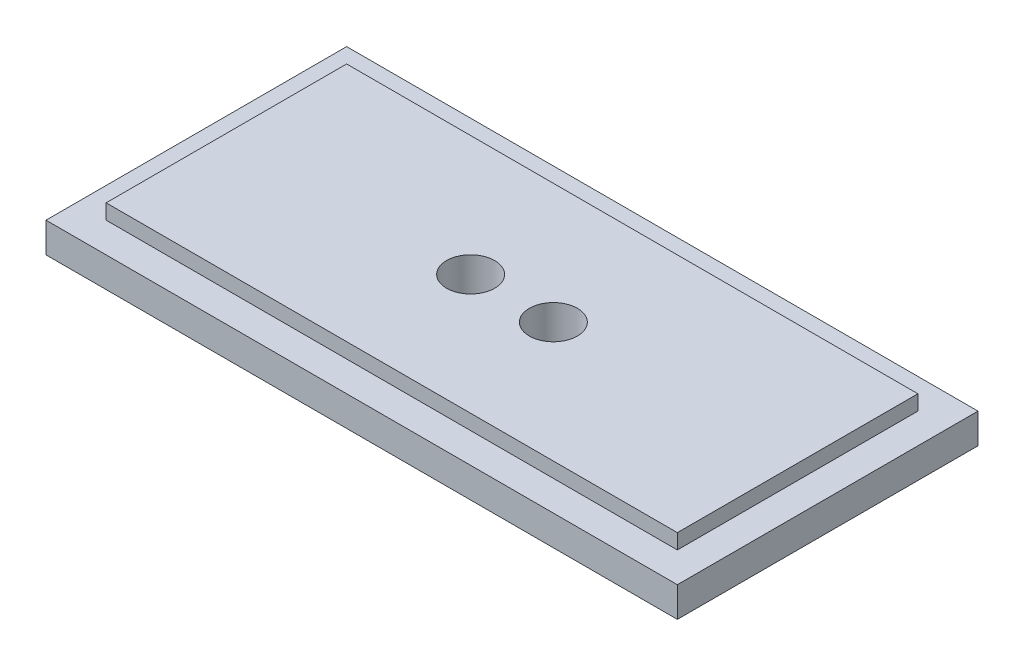
ISO-10303-21;
HEADER;
FILE_DESCRIPTION(('STEP AP214'),'2;1');
FILE_NAME('part.step','',(''),(''),'','','');
FILE_SCHEMA(('AUTOMOTIVE_DESIGN { 1 0 10303 214 1 1 1 1 }'));
ENDSEC;
DATA;
#1=APPLICATION_CONTEXT('core data for automotive mechanical design processes');
#2=APPLICATION_PROTOCOL_DEFINITION('international standard','automotive_design',2000,#1);
#3=PRODUCT_CONTEXT('',#1,'mechanical');
#4=PRODUCT('Part','Part','',(#3));
#5=PRODUCT_RELATED_PRODUCT_CATEGORY('part','',(#4));
#6=PRODUCT_DEFINITION_FORMATION('','',#4);
#7=PRODUCT_DEFINITION_CONTEXT('part definition',#1,'design');
#8=PRODUCT_DEFINITION('design','',#6,#7);
#9=PRODUCT_DEFINITION_SHAPE('','',#8);
#10=(LENGTH_UNIT() NAMED_UNIT(*) SI_UNIT(.MILLI.,.METRE.));
#11=(NAMED_UNIT(*) PLANE_ANGLE_UNIT() SI_UNIT($,.RADIAN.));
#12=(NAMED_UNIT(*) SI_UNIT($,.STERADIAN.) SOLID_ANGLE_UNIT());
#13=UNCERTAINTY_MEASURE_WITH_UNIT(LENGTH_MEASURE(1.E-05),#10,'distance_accuracy_value','');
#14=(GEOMETRIC_REPRESENTATION_CONTEXT(3) GLOBAL_UNCERTAINTY_ASSIGNED_CONTEXT((#13)) GLOBAL_UNIT_ASSIGNED_CONTEXT((#10,
#11,#12)) REPRESENTATION_CONTEXT('',''));
#15=CARTESIAN_POINT('',(0.,0.,0.));
#16=DIRECTION('',(0.,0.,1.));
#17=DIRECTION('',(1.,0.,0.));
#18=AXIS2_PLACEMENT_3D('',#15,#16,#17);
#19=CARTESIAN_POINT('',(0.,0.,0.));
#20=DIRECTION('',(0.,1.,0.));
#21=DIRECTION('',(0.,0.,1.));
#22=AXIS2_PLACEMENT_3D('',#19,#20,#21);
#23=PLANE('',#22);
#24=DIRECTION('',(0.,0.,1.));
#25=VECTOR('',#24,1.);
#26=CARTESIAN_POINT('',(-105.,0.,50.));
#27=LINE('',#26,#25);
#28=CARTESIAN_POINT('',(-105.,0.,-50.));
#29=VERTEX_POINT('',#28);
#30=CARTESIAN_POINT('',(-105.,0.,50.));
#31=VERTEX_POINT('',#30);
#32=EDGE_CURVE('E260',#29,#31,#27,.T.);
#33=ORIENTED_EDGE('',*,*,#32,.F.);
#34=DIRECTION('',(-1.,0.,0.));
#35=VECTOR('',#34,1.);
#36=CARTESIAN_POINT('',(105.,0.,-50.));
#37=LINE('',#36,#35);
#38=CARTESIAN_POINT('',(105.,0.,-50.));
#39=VERTEX_POINT('',#38);
#40=EDGE_CURVE('E265',#39,#29,#37,.T.);
#41=ORIENTED_EDGE('',*,*,#40,.F.);
#42=DIRECTION('',(0.,0.,-1.));
#43=VECTOR('',#42,1.);
#44=CARTESIAN_POINT('',(105.,0.,50.));
#45=LINE('',#44,#43);
#46=CARTESIAN_POINT('',(105.,0.,50.));
#47=VERTEX_POINT('',#46);
#48=EDGE_CURVE('E276',#47,#39,#45,.T.);
#49=ORIENTED_EDGE('',*,*,#48,.F.);
#50=DIRECTION('',(1.,0.,0.));
#51=VECTOR('',#50,1.);
#52=CARTESIAN_POINT('',(105.,0.,50.));
#53=LINE('',#52,#51);
#54=EDGE_CURVE('E274',#31,#47,#53,.T.);
#55=ORIENTED_EDGE('',*,*,#54,.F.);
#56=EDGE_LOOP('',(#33,#41,#49,#55));
#57=FACE_BOUND('',#56,.T.);
#58=DIRECTION('',(1.,0.,0.));
#59=VECTOR('',#58,1.);
#60=CARTESIAN_POINT('',(28.5,0.,-16.));
#61=LINE('',#60,#59);
#62=CARTESIAN_POINT('',(-28.5,0.,-16.));
#63=VERTEX_POINT('',#62);
#64=CARTESIAN_POINT('',(28.5,0.,-16.));
#65=VERTEX_POINT('',#64);
#66=EDGE_CURVE('E175',#63,#65,#61,.T.);
#67=ORIENTED_EDGE('',*,*,#66,.F.);
#68=DIRECTION('',(0.,0.,-1.));
#69=VECTOR('',#68,1.);
#70=CARTESIAN_POINT('',(-28.5,0.,-16.));
#71=LINE('',#70,#69);
#72=CARTESIAN_POINT('',(-28.5,0.,16.));
#73=VERTEX_POINT('',#72);
#74=EDGE_CURVE('E204',#73,#63,#71,.T.);
#75=ORIENTED_EDGE('',*,*,#74,.F.);
#76=DIRECTION('',(-1.,0.,0.));
#77=VECTOR('',#76,1.);
#78=CARTESIAN_POINT('',(28.5,0.,16.));
#79=LINE('',#78,#77);
#80=CARTESIAN_POINT('',(28.5,0.,16.));
#81=VERTEX_POINT('',#80);
#82=EDGE_CURVE('E65',#81,#73,#79,.T.);
#83=ORIENTED_EDGE('',*,*,#82,.F.);
#84=DIRECTION('',(0.,0.,1.));
#85=VECTOR('',#84,1.);
#86=CARTESIAN_POINT('',(28.5,0.,-16.));
#87=LINE('',#86,#85);
#88=EDGE_CURVE('E60',#65,#81,#87,.T.);
#89=ORIENTED_EDGE('',*,*,#88,.F.);
#90=EDGE_LOOP('',(#67,#75,#83,#89));
#91=FACE_BOUND('',#90,.T.);
#92=ADVANCED_FACE('F43',(#57,#91),#23,.F.);
#93=CARTESIAN_POINT('',(-105.,10.,50.));
#94=DIRECTION('',(1.,0.,0.));
#95=DIRECTION('',(0.,0.,-1.));
#96=AXIS2_PLACEMENT_3D('',#93,#94,#95);
#97=PLANE('',#96);
#98=ORIENTED_EDGE('',*,*,#32,.T.);
#99=DIRECTION('',(0.,-1.,0.));
#100=VECTOR('',#99,1.);
#101=CARTESIAN_POINT('',(-105.,10.,50.));
#102=LINE('',#101,#100);
#103=CARTESIAN_POINT('',(-105.,10.,50.));
#104=VERTEX_POINT('',#103);
#105=EDGE_CURVE('E11',#104,#31,#102,.T.);
#106=ORIENTED_EDGE('',*,*,#105,.F.);
#107=DIRECTION('',(0.,0.,1.));
#108=VECTOR('',#107,1.);
#109=CARTESIAN_POINT('',(-105.,10.,50.));
#110=LINE('',#109,#108);
#111=CARTESIAN_POINT('',(-105.,10.,-50.));
#112=VERTEX_POINT('',#111);
#113=EDGE_CURVE('E261',#112,#104,#110,.T.);
#114=ORIENTED_EDGE('',*,*,#113,.F.);
#115=DIRECTION('',(0.,-1.,0.));
#116=VECTOR('',#115,1.);
#117=CARTESIAN_POINT('',(-105.,10.,-50.));
#118=LINE('',#117,#116);
#119=EDGE_CURVE('E271',#112,#29,#118,.T.);
#120=ORIENTED_EDGE('',*,*,#119,.T.);
#121=EDGE_LOOP('',(#98,#106,#114,#120));
#122=FACE_BOUND('',#121,.T.);
#123=ADVANCED_FACE('F45',(#122),#97,.F.);
#124=CARTESIAN_POINT('',(105.,10.,50.));
#125=DIRECTION('',(0.,0.,-1.));
#126=DIRECTION('',(-1.,0.,0.));
#127=AXIS2_PLACEMENT_3D('',#124,#125,#126);
#128=PLANE('',#127);
#129=ORIENTED_EDGE('',*,*,#54,.T.);
#130=DIRECTION('',(0.,-1.,0.));
#131=VECTOR('',#130,1.);
#132=CARTESIAN_POINT('',(105.,10.,50.));
#133=LINE('',#132,#131);
#134=CARTESIAN_POINT('',(105.,10.,50.));
#135=VERTEX_POINT('',#134);
#136=EDGE_CURVE('E52',#135,#47,#133,.T.);
#137=ORIENTED_EDGE('',*,*,#136,.F.);
#138=DIRECTION('',(1.,0.,0.));
#139=VECTOR('',#138,1.);
#140=CARTESIAN_POINT('',(105.,10.,50.));
#141=LINE('',#140,#139);
#142=EDGE_CURVE('E264',#104,#135,#141,.T.);
#143=ORIENTED_EDGE('',*,*,#142,.F.);
#144=ORIENTED_EDGE('',*,*,#105,.T.);
#145=EDGE_LOOP('',(#129,#137,#143,#144));
#146=FACE_BOUND('',#145,.T.);
#147=ADVANCED_FACE('F325',(#146),#128,.F.);
#148=CARTESIAN_POINT('',(105.,10.,50.));
#149=DIRECTION('',(-1.,0.,0.));
#150=DIRECTION('',(0.,0.,1.));
#151=AXIS2_PLACEMENT_3D('',#148,#149,#150);
#152=PLANE('',#151);
#153=ORIENTED_EDGE('',*,*,#48,.T.);
#154=DIRECTION('',(0.,-1.,0.));
#155=VECTOR('',#154,1.);
#156=CARTESIAN_POINT('',(105.,10.,-50.));
#157=LINE('',#156,#155);
#158=CARTESIAN_POINT('',(105.,10.,-50.));
#159=VERTEX_POINT('',#158);
#160=EDGE_CURVE('E281',#159,#39,#157,.T.);
#161=ORIENTED_EDGE('',*,*,#160,.F.);
#162=DIRECTION('',(0.,0.,-1.));
#163=VECTOR('',#162,1.);
#164=CARTESIAN_POINT('',(105.,10.,50.));
#165=LINE('',#164,#163);
#166=EDGE_CURVE('E267',#135,#159,#165,.T.);
#167=ORIENTED_EDGE('',*,*,#166,.F.);
#168=ORIENTED_EDGE('',*,*,#136,.T.);
#169=EDGE_LOOP('',(#153,#161,#167,#168));
#170=FACE_BOUND('',#169,.T.);
#171=ADVANCED_FACE('F335',(#170),#152,.F.);
#172=CARTESIAN_POINT('',(105.,10.,-50.));
#173=DIRECTION('',(0.,0.,1.));
#174=DIRECTION('',(1.,0.,0.));
#175=AXIS2_PLACEMENT_3D('',#172,#173,#174);
#176=PLANE('',#175);
#177=ORIENTED_EDGE('',*,*,#40,.T.);
#178=ORIENTED_EDGE('',*,*,#119,.F.);
#179=DIRECTION('',(-1.,0.,0.));
#180=VECTOR('',#179,1.);
#181=CARTESIAN_POINT('',(105.,10.,-50.));
#182=LINE('',#181,#180);
#183=EDGE_CURVE('E269',#159,#112,#182,.T.);
#184=ORIENTED_EDGE('',*,*,#183,.F.);
#185=ORIENTED_EDGE('',*,*,#160,.T.);
#186=EDGE_LOOP('',(#177,#178,#184,#185));
#187=FACE_BOUND('',#186,.T.);
#188=ADVANCED_FACE('F332',(#187),#176,.F.);
#189=CARTESIAN_POINT('',(0.,10.,0.));
#190=DIRECTION('',(0.,1.,0.));
#191=DIRECTION('',(0.,0.,1.));
#192=AXIS2_PLACEMENT_3D('',#189,#190,#191);
#193=PLANE('',#192);
#194=DIRECTION('',(0.,0.,1.));
#195=VECTOR('',#194,1.);
#196=CARTESIAN_POINT('',(-95.,10.,40.));
#197=LINE('',#196,#195);
#198=CARTESIAN_POINT('',(-95.,10.,-40.));
#199=VERTEX_POINT('',#198);
#200=CARTESIAN_POINT('',(-95.,10.,40.));
#201=VERTEX_POINT('',#200);
#202=EDGE_CURVE('E227',#199,#201,#197,.T.);
#203=ORIENTED_EDGE('',*,*,#202,.F.);
#204=DIRECTION('',(-1.,0.,0.));
#205=VECTOR('',#204,1.);
#206=CARTESIAN_POINT('',(95.,10.,-40.));
#207=LINE('',#206,#205);
#208=CARTESIAN_POINT('',(95.,10.,-40.));
#209=VERTEX_POINT('',#208);
#210=EDGE_CURVE('E232',#209,#199,#207,.T.);
#211=ORIENTED_EDGE('',*,*,#210,.F.);
#212=DIRECTION('',(0.,0.,-1.));
#213=VECTOR('',#212,1.);
#214=CARTESIAN_POINT('',(95.,10.,40.));
#215=LINE('',#214,#213);
#216=CARTESIAN_POINT('',(95.,10.,40.));
#217=VERTEX_POINT('',#216);
#218=EDGE_CURVE('E244',#217,#209,#215,.T.);
#219=ORIENTED_EDGE('',*,*,#218,.F.);
#220=DIRECTION('',(1.,0.,0.));
#221=VECTOR('',#220,1.);
#222=CARTESIAN_POINT('',(95.,10.,40.));
#223=LINE('',#222,#221);
#224=EDGE_CURVE('E241',#201,#217,#223,.T.);
#225=ORIENTED_EDGE('',*,*,#224,.F.);
#226=EDGE_LOOP('',(#203,#211,#219,#225));
#227=FACE_BOUND('',#226,.T.);
#228=ORIENTED_EDGE('',*,*,#113,.T.);
#229=ORIENTED_EDGE('',*,*,#142,.T.);
#230=ORIENTED_EDGE('',*,*,#166,.T.);
#231=ORIENTED_EDGE('',*,*,#183,.T.);
#232=EDGE_LOOP('',(#228,#229,#230,#231));
#233=FACE_BOUND('',#232,.T.);
#234=ADVANCED_FACE('F330',(#227,#233),#193,.T.);
#235=CARTESIAN_POINT('',(-95.,15.,40.));
#236=DIRECTION('',(1.,0.,0.));
#237=DIRECTION('',(0.,0.,-1.));
#238=AXIS2_PLACEMENT_3D('',#235,#236,#237);
#239=PLANE('',#238);
#240=ORIENTED_EDGE('',*,*,#202,.T.);
#241=DIRECTION('',(0.,-1.,0.));
#242=VECTOR('',#241,1.);
#243=CARTESIAN_POINT('',(-95.,15.,40.));
#244=LINE('',#243,#242);
#245=CARTESIAN_POINT('',(-95.,15.,40.));
#246=VERTEX_POINT('',#245);
#247=EDGE_CURVE('E257',#246,#201,#244,.T.);
#248=ORIENTED_EDGE('',*,*,#247,.F.);
#249=DIRECTION('',(0.,0.,1.));
#250=VECTOR('',#249,1.);
#251=CARTESIAN_POINT('',(-95.,15.,40.));
#252=LINE('',#251,#250);
#253=CARTESIAN_POINT('',(-95.,15.,-40.));
#254=VERTEX_POINT('',#253);
#255=EDGE_CURVE('E228',#254,#246,#252,.T.);
#256=ORIENTED_EDGE('',*,*,#255,.F.);
#257=DIRECTION('',(0.,-1.,0.));
#258=VECTOR('',#257,1.);
#259=CARTESIAN_POINT('',(-95.,15.,-40.));
#260=LINE('',#259,#258);
#261=EDGE_CURVE('E238',#254,#199,#260,.T.);
#262=ORIENTED_EDGE('',*,*,#261,.T.);
#263=EDGE_LOOP('',(#240,#248,#256,#262));
#264=FACE_BOUND('',#263,.T.);
#265=ADVANCED_FACE('F354',(#264),#239,.F.);
#266=CARTESIAN_POINT('',(95.,15.,40.));
#267=DIRECTION('',(0.,0.,-1.));
#268=DIRECTION('',(-1.,0.,0.));
#269=AXIS2_PLACEMENT_3D('',#266,#267,#268);
#270=PLANE('',#269);
#271=ORIENTED_EDGE('',*,*,#224,.T.);
#272=DIRECTION('',(0.,-1.,0.));
#273=VECTOR('',#272,1.);
#274=CARTESIAN_POINT('',(95.,15.,40.));
#275=LINE('',#274,#273);
#276=CARTESIAN_POINT('',(95.,15.,40.));
#277=VERTEX_POINT('',#276);
#278=EDGE_CURVE('E254',#277,#217,#275,.T.);
#279=ORIENTED_EDGE('',*,*,#278,.F.);
#280=DIRECTION('',(1.,0.,0.));
#281=VECTOR('',#280,1.);
#282=CARTESIAN_POINT('',(95.,15.,40.));
#283=LINE('',#282,#281);
#284=EDGE_CURVE('E231',#246,#277,#283,.T.);
#285=ORIENTED_EDGE('',*,*,#284,.F.);
#286=ORIENTED_EDGE('',*,*,#247,.T.);
#287=EDGE_LOOP('',(#271,#279,#285,#286));
#288=FACE_BOUND('',#287,.T.);
#289=ADVANCED_FACE('F359',(#288),#270,.F.);
#290=CARTESIAN_POINT('',(95.,15.,40.));
#291=DIRECTION('',(-1.,0.,0.));
#292=DIRECTION('',(0.,0.,1.));
#293=AXIS2_PLACEMENT_3D('',#290,#291,#292);
#294=PLANE('',#293);
#295=ORIENTED_EDGE('',*,*,#218,.T.);
#296=DIRECTION('',(0.,-1.,0.));
#297=VECTOR('',#296,1.);
#298=CARTESIAN_POINT('',(95.,15.,-40.));
#299=LINE('',#298,#297);
#300=CARTESIAN_POINT('',(95.,15.,-40.));
#301=VERTEX_POINT('',#300);
#302=EDGE_CURVE('E251',#301,#209,#299,.T.);
#303=ORIENTED_EDGE('',*,*,#302,.F.);
#304=DIRECTION('',(0.,0.,-1.));
#305=VECTOR('',#304,1.);
#306=CARTESIAN_POINT('',(95.,15.,40.));
#307=LINE('',#306,#305);
#308=EDGE_CURVE('E234',#277,#301,#307,.T.);
#309=ORIENTED_EDGE('',*,*,#308,.F.);
#310=ORIENTED_EDGE('',*,*,#278,.T.);
#311=EDGE_LOOP('',(#295,#303,#309,#310));
#312=FACE_BOUND('',#311,.T.);
#313=ADVANCED_FACE('F371',(#312),#294,.F.);
#314=CARTESIAN_POINT('',(95.,15.,-40.));
#315=DIRECTION('',(0.,0.,1.));
#316=DIRECTION('',(1.,0.,0.));
#317=AXIS2_PLACEMENT_3D('',#314,#315,#316);
#318=PLANE('',#317);
#319=ORIENTED_EDGE('',*,*,#210,.T.);
#320=ORIENTED_EDGE('',*,*,#261,.F.);
#321=DIRECTION('',(-1.,0.,0.));
#322=VECTOR('',#321,1.);
#323=CARTESIAN_POINT('',(95.,15.,-40.));
#324=LINE('',#323,#322);
#325=EDGE_CURVE('E236',#301,#254,#324,.T.);
#326=ORIENTED_EDGE('',*,*,#325,.F.);
#327=ORIENTED_EDGE('',*,*,#302,.T.);
#328=EDGE_LOOP('',(#319,#320,#326,#327));
#329=FACE_BOUND('',#328,.T.);
#330=ADVANCED_FACE('F364',(#329),#318,.F.);
#331=CARTESIAN_POINT('',(0.,15.,0.));
#332=DIRECTION('',(0.,1.,0.));
#333=DIRECTION('',(0.,0.,1.));
#334=AXIS2_PLACEMENT_3D('',#331,#332,#333);
#335=PLANE('',#334);
#336=CARTESIAN_POINT('',(-13.76,15.,0.));
#337=DIRECTION('',(0.,-1.,0.));
#338=DIRECTION('',(0.,0.,-1.));
#339=AXIS2_PLACEMENT_3D('',#336,#337,#338);
#340=CIRCLE('',#339,8.);
#341=CARTESIAN_POINT('',(-13.76,15.,-8.));
#342=VERTEX_POINT('',#341);
#343=EDGE_CURVE('E287',#342,#342,#340,.T.);
#344=ORIENTED_EDGE('',*,*,#343,.T.);
#345=EDGE_LOOP('',(#344));
#346=FACE_BOUND('',#345,.T.);
#347=CARTESIAN_POINT('',(13.76,15.,0.));
#348=DIRECTION('',(0.,-1.,0.));
#349=DIRECTION('',(0.,0.,1.));
#350=AXIS2_PLACEMENT_3D('',#347,#348,#349);
#351=CIRCLE('',#350,8.);
#352=CARTESIAN_POINT('',(13.76,15.,8.));
#353=VERTEX_POINT('',#352);
#354=EDGE_CURVE('E292',#353,#353,#351,.T.);
#355=ORIENTED_EDGE('',*,*,#354,.T.);
#356=EDGE_LOOP('',(#355));
#357=FACE_BOUND('',#356,.T.);
#358=ORIENTED_EDGE('',*,*,#255,.T.);
#359=ORIENTED_EDGE('',*,*,#284,.T.);
#360=ORIENTED_EDGE('',*,*,#308,.T.);
#361=ORIENTED_EDGE('',*,*,#325,.T.);
#362=EDGE_LOOP('',(#358,#359,#360,#361));
#363=FACE_BOUND('',#362,.T.);
#364=ADVANCED_FACE('F299',(#346,#357,#363),#335,.T.);
#365=CARTESIAN_POINT('',(0.,-15.,0.));
#366=DIRECTION('',(0.,1.,0.));
#367=DIRECTION('',(0.,0.,1.));
#368=AXIS2_PLACEMENT_3D('',#365,#366,#367);
#369=PLANE('',#368);
#370=DIRECTION('',(1.,0.,0.));
#371=VECTOR('',#370,1.);
#372=CARTESIAN_POINT('',(28.5,-15.,-16.));
#373=LINE('',#372,#371);
#374=CARTESIAN_POINT('',(-28.5,-15.,-16.));
#375=VERTEX_POINT('',#374);
#376=CARTESIAN_POINT('',(28.5,-15.,-16.));
#377=VERTEX_POINT('',#376);
#378=EDGE_CURVE('E200',#375,#377,#373,.T.);
#379=ORIENTED_EDGE('',*,*,#378,.T.);
#380=DIRECTION('',(0.,0.,1.));
#381=VECTOR('',#380,1.);
#382=CARTESIAN_POINT('',(28.5,-15.,-16.));
#383=LINE('',#382,#381);
#384=CARTESIAN_POINT('',(28.5,-15.,16.));
#385=VERTEX_POINT('',#384);
#386=EDGE_CURVE('E203',#377,#385,#383,.T.);
#387=ORIENTED_EDGE('',*,*,#386,.T.);
#388=DIRECTION('',(-1.,0.,0.));
#389=VECTOR('',#388,1.);
#390=CARTESIAN_POINT('',(28.5,-15.,16.));
#391=LINE('',#390,#389);
#392=CARTESIAN_POINT('',(-28.5,-15.,16.));
#393=VERTEX_POINT('',#392);
#394=EDGE_CURVE('E206',#385,#393,#391,.T.);
#395=ORIENTED_EDGE('',*,*,#394,.T.);
#396=DIRECTION('',(0.,0.,-1.));
#397=VECTOR('',#396,1.);
#398=CARTESIAN_POINT('',(-28.5,-15.,-16.));
#399=LINE('',#398,#397);
#400=EDGE_CURVE('E208',#393,#375,#399,.T.);
#401=ORIENTED_EDGE('',*,*,#400,.T.);
#402=EDGE_LOOP('',(#379,#387,#395,#401));
#403=FACE_BOUND('',#402,.T.);
#404=DIRECTION('',(0.,0.,-1.));
#405=VECTOR('',#404,1.);
#406=CARTESIAN_POINT('',(-23.5,-15.,-11.));
#407=LINE('',#406,#405);
#408=CARTESIAN_POINT('',(-23.5,-15.,11.));
#409=VERTEX_POINT('',#408);
#410=CARTESIAN_POINT('',(-23.5,-15.,-11.));
#411=VERTEX_POINT('',#410);
#412=EDGE_CURVE('E157',#409,#411,#407,.T.);
#413=ORIENTED_EDGE('',*,*,#412,.F.);
#414=DIRECTION('',(-1.,0.,0.));
#415=VECTOR('',#414,1.);
#416=CARTESIAN_POINT('',(23.5,-15.,11.));
#417=LINE('',#416,#415);
#418=CARTESIAN_POINT('',(23.5,-15.,11.));
#419=VERTEX_POINT('',#418);
#420=EDGE_CURVE('E183',#419,#409,#417,.T.);
#421=ORIENTED_EDGE('',*,*,#420,.F.);
#422=DIRECTION('',(0.,0.,1.));
#423=VECTOR('',#422,1.);
#424=CARTESIAN_POINT('',(23.5,-15.,-11.));
#425=LINE('',#424,#423);
#426=CARTESIAN_POINT('',(23.5,-15.,-11.));
#427=VERTEX_POINT('',#426);
#428=EDGE_CURVE('E181',#427,#419,#425,.T.);
#429=ORIENTED_EDGE('',*,*,#428,.F.);
#430=DIRECTION('',(1.,0.,0.));
#431=VECTOR('',#430,1.);
#432=CARTESIAN_POINT('',(23.5,-15.,-11.));
#433=LINE('',#432,#431);
#434=EDGE_CURVE('E167',#411,#427,#433,.T.);
#435=ORIENTED_EDGE('',*,*,#434,.F.);
#436=EDGE_LOOP('',(#413,#421,#429,#435));
#437=FACE_BOUND('',#436,.T.);
#438=ADVANCED_FACE('F179',(#403,#437),#369,.F.);
#439=CARTESIAN_POINT('',(28.5,-15.,-16.));
#440=DIRECTION('',(0.,0.,1.));
#441=DIRECTION('',(1.,0.,0.));
#442=AXIS2_PLACEMENT_3D('',#439,#440,#441);
#443=PLANE('',#442);
#444=ORIENTED_EDGE('',*,*,#66,.T.);
#445=DIRECTION('',(0.,1.,0.));
#446=VECTOR('',#445,1.);
#447=CARTESIAN_POINT('',(28.5,-15.,-16.));
#448=LINE('',#447,#446);
#449=EDGE_CURVE('E225',#377,#65,#448,.T.);
#450=ORIENTED_EDGE('',*,*,#449,.F.);
#451=ORIENTED_EDGE('',*,*,#378,.F.);
#452=DIRECTION('',(0.,1.,0.));
#453=VECTOR('',#452,1.);
#454=CARTESIAN_POINT('',(-28.5,-15.,-16.));
#455=LINE('',#454,#453);
#456=EDGE_CURVE('E210',#375,#63,#455,.T.);
#457=ORIENTED_EDGE('',*,*,#456,.T.);
#458=EDGE_LOOP('',(#444,#450,#451,#457));
#459=FACE_BOUND('',#458,.T.);
#460=ADVANCED_FACE('F383',(#459),#443,.F.);
#461=CARTESIAN_POINT('',(28.5,-15.,-16.));
#462=DIRECTION('',(-1.,0.,0.));
#463=DIRECTION('',(0.,0.,1.));
#464=AXIS2_PLACEMENT_3D('',#461,#462,#463);
#465=PLANE('',#464);
#466=ORIENTED_EDGE('',*,*,#88,.T.);
#467=DIRECTION('',(0.,1.,0.));
#468=VECTOR('',#467,1.);
#469=CARTESIAN_POINT('',(28.5,-15.,16.));
#470=LINE('',#469,#468);
#471=EDGE_CURVE('E222',#385,#81,#470,.T.);
#472=ORIENTED_EDGE('',*,*,#471,.F.);
#473=ORIENTED_EDGE('',*,*,#386,.F.);
#474=ORIENTED_EDGE('',*,*,#449,.T.);
#475=EDGE_LOOP('',(#466,#472,#473,#474));
#476=FACE_BOUND('',#475,.T.);
#477=ADVANCED_FACE('F386',(#476),#465,.F.);
#478=CARTESIAN_POINT('',(28.5,-15.,16.));
#479=DIRECTION('',(0.,0.,-1.));
#480=DIRECTION('',(-1.,0.,0.));
#481=AXIS2_PLACEMENT_3D('',#478,#479,#480);
#482=PLANE('',#481);
#483=ORIENTED_EDGE('',*,*,#82,.T.);
#484=DIRECTION('',(0.,1.,0.));
#485=VECTOR('',#484,1.);
#486=CARTESIAN_POINT('',(-28.5,-15.,16.));
#487=LINE('',#486,#485);
#488=EDGE_CURVE('E219',#393,#73,#487,.T.);
#489=ORIENTED_EDGE('',*,*,#488,.F.);
#490=ORIENTED_EDGE('',*,*,#394,.F.);
#491=ORIENTED_EDGE('',*,*,#471,.T.);
#492=EDGE_LOOP('',(#483,#489,#490,#491));
#493=FACE_BOUND('',#492,.T.);
#494=ADVANCED_FACE('F390',(#493),#482,.F.);
#495=CARTESIAN_POINT('',(-28.5,-15.,-16.));
#496=DIRECTION('',(1.,0.,0.));
#497=DIRECTION('',(0.,0.,-1.));
#498=AXIS2_PLACEMENT_3D('',#495,#496,#497);
#499=PLANE('',#498);
#500=ORIENTED_EDGE('',*,*,#74,.T.);
#501=ORIENTED_EDGE('',*,*,#456,.F.);
#502=ORIENTED_EDGE('',*,*,#400,.F.);
#503=ORIENTED_EDGE('',*,*,#488,.T.);
#504=EDGE_LOOP('',(#500,#501,#502,#503));
#505=FACE_BOUND('',#504,.T.);
#506=ADVANCED_FACE('F394',(#505),#499,.F.);
#507=CARTESIAN_POINT('',(-23.5,-15.,-11.));
#508=DIRECTION('',(1.,0.,0.));
#509=DIRECTION('',(0.,0.,-1.));
#510=AXIS2_PLACEMENT_3D('',#507,#508,#509);
#511=PLANE('',#510);
#512=DIRECTION('',(0.,0.,-1.));
#513=VECTOR('',#512,1.);
#514=CARTESIAN_POINT('',(-23.5,0.,-11.));
#515=LINE('',#514,#513);
#516=CARTESIAN_POINT('',(-23.5,0.,11.));
#517=VERTEX_POINT('',#516);
#518=CARTESIAN_POINT('',(-23.5,0.,-11.));
#519=VERTEX_POINT('',#518);
#520=EDGE_CURVE('E188',#517,#519,#515,.T.);
#521=ORIENTED_EDGE('',*,*,#520,.F.);
#522=DIRECTION('',(0.,1.,0.));
#523=VECTOR('',#522,1.);
#524=CARTESIAN_POINT('',(-23.5,-15.,11.));
#525=LINE('',#524,#523);
#526=EDGE_CURVE('E163',#409,#517,#525,.T.);
#527=ORIENTED_EDGE('',*,*,#526,.F.);
#528=ORIENTED_EDGE('',*,*,#412,.T.);
#529=DIRECTION('',(0.,1.,0.));
#530=VECTOR('',#529,1.);
#531=CARTESIAN_POINT('',(-23.5,-15.,-11.));
#532=LINE('',#531,#530);
#533=EDGE_CURVE('E161',#411,#519,#532,.T.);
#534=ORIENTED_EDGE('',*,*,#533,.T.);
#535=EDGE_LOOP('',(#521,#527,#528,#534));
#536=FACE_BOUND('',#535,.T.);
#537=ADVANCED_FACE('F160',(#536),#511,.T.);
#538=CARTESIAN_POINT('',(23.5,-15.,-11.));
#539=DIRECTION('',(0.,0.,1.));
#540=DIRECTION('',(1.,0.,0.));
#541=AXIS2_PLACEMENT_3D('',#538,#539,#540);
#542=PLANE('',#541);
#543=DIRECTION('',(1.,0.,0.));
#544=VECTOR('',#543,1.);
#545=CARTESIAN_POINT('',(23.5,0.,-11.));
#546=LINE('',#545,#544);
#547=CARTESIAN_POINT('',(23.5,0.,-11.));
#548=VERTEX_POINT('',#547);
#549=EDGE_CURVE('E174',#519,#548,#546,.T.);
#550=ORIENTED_EDGE('',*,*,#549,.F.);
#551=ORIENTED_EDGE('',*,*,#533,.F.);
#552=ORIENTED_EDGE('',*,*,#434,.T.);
#553=DIRECTION('',(0.,1.,0.));
#554=VECTOR('',#553,1.);
#555=CARTESIAN_POINT('',(23.5,-15.,-11.));
#556=LINE('',#555,#554);
#557=EDGE_CURVE('E176',#427,#548,#556,.T.);
#558=ORIENTED_EDGE('',*,*,#557,.T.);
#559=EDGE_LOOP('',(#550,#551,#552,#558));
#560=FACE_BOUND('',#559,.T.);
#561=ADVANCED_FACE('F171',(#560),#542,.T.);
#562=CARTESIAN_POINT('',(23.5,-15.,-11.));
#563=DIRECTION('',(-1.,0.,0.));
#564=DIRECTION('',(0.,0.,1.));
#565=AXIS2_PLACEMENT_3D('',#562,#563,#564);
#566=PLANE('',#565);
#567=DIRECTION('',(0.,0.,1.));
#568=VECTOR('',#567,1.);
#569=CARTESIAN_POINT('',(23.5,0.,-11.));
#570=LINE('',#569,#568);
#571=CARTESIAN_POINT('',(23.5,0.,11.));
#572=VERTEX_POINT('',#571);
#573=EDGE_CURVE('E191',#548,#572,#570,.T.);
#574=ORIENTED_EDGE('',*,*,#573,.F.);
#575=ORIENTED_EDGE('',*,*,#557,.F.);
#576=ORIENTED_EDGE('',*,*,#428,.T.);
#577=DIRECTION('',(0.,1.,0.));
#578=VECTOR('',#577,1.);
#579=CARTESIAN_POINT('',(23.5,-15.,11.));
#580=LINE('',#579,#578);
#581=EDGE_CURVE('E197',#419,#572,#580,.T.);
#582=ORIENTED_EDGE('',*,*,#581,.T.);
#583=EDGE_LOOP('',(#574,#575,#576,#582));
#584=FACE_BOUND('',#583,.T.);
#585=ADVANCED_FACE('F406',(#584),#566,.T.);
#586=CARTESIAN_POINT('',(23.5,-15.,11.));
#587=DIRECTION('',(0.,0.,-1.));
#588=DIRECTION('',(-1.,0.,0.));
#589=AXIS2_PLACEMENT_3D('',#586,#587,#588);
#590=PLANE('',#589);
#591=DIRECTION('',(-1.,0.,0.));
#592=VECTOR('',#591,1.);
#593=CARTESIAN_POINT('',(23.5,0.,11.));
#594=LINE('',#593,#592);
#595=EDGE_CURVE('E168',#572,#517,#594,.T.);
#596=ORIENTED_EDGE('',*,*,#595,.F.);
#597=ORIENTED_EDGE('',*,*,#581,.F.);
#598=ORIENTED_EDGE('',*,*,#420,.T.);
#599=ORIENTED_EDGE('',*,*,#526,.T.);
#600=EDGE_LOOP('',(#596,#597,#598,#599));
#601=FACE_BOUND('',#600,.T.);
#602=ADVANCED_FACE('F314',(#601),#590,.T.);
#603=CARTESIAN_POINT('',(-13.76,0.,0.));
#604=DIRECTION('',(0.,1.,0.));
#605=DIRECTION('',(0.,0.,1.));
#606=AXIS2_PLACEMENT_3D('',#603,#604,#605);
#607=CIRCLE('',#606,8.);
#608=CARTESIAN_POINT('',(-13.76,0.,8.));
#609=VERTEX_POINT('',#608);
#610=EDGE_CURVE('E47',#609,#609,#607,.T.);
#611=ORIENTED_EDGE('',*,*,#610,.T.);
#612=EDGE_LOOP('',(#611));
#613=FACE_BOUND('',#612,.T.);
#614=CARTESIAN_POINT('',(13.76,0.,0.));
#615=DIRECTION('',(0.,1.,0.));
#616=DIRECTION('',(0.,0.,1.));
#617=AXIS2_PLACEMENT_3D('',#614,#615,#616);
#618=CIRCLE('',#617,8.);
#619=CARTESIAN_POINT('',(13.76,0.,8.));
#620=VERTEX_POINT('',#619);
#621=EDGE_CURVE('E285',#620,#620,#618,.T.);
#622=ORIENTED_EDGE('',*,*,#621,.T.);
#623=EDGE_LOOP('',(#622));
#624=FACE_BOUND('',#623,.T.);
#625=ORIENTED_EDGE('',*,*,#595,.T.);
#626=ORIENTED_EDGE('',*,*,#520,.T.);
#627=ORIENTED_EDGE('',*,*,#549,.T.);
#628=ORIENTED_EDGE('',*,*,#573,.T.);
#629=EDGE_LOOP('',(#625,#626,#627,#628));
#630=FACE_BOUND('',#629,.T.);
#631=ADVANCED_FACE('F306',(#613,#624,#630),#23,.F.);
#632=CARTESIAN_POINT('',(13.76,15.,0.));
#633=DIRECTION('',(0.,-1.,0.));
#634=DIRECTION('',(0.,0.,-1.));
#635=AXIS2_PLACEMENT_3D('',#632,#633,#634);
#636=CYLINDRICAL_SURFACE('',#635,8.);
#637=ORIENTED_EDGE('',*,*,#354,.F.);
#638=EDGE_LOOP('',(#637));
#639=FACE_BOUND('',#638,.T.);
#640=ORIENTED_EDGE('',*,*,#621,.F.);
#641=EDGE_LOOP('',(#640));
#642=FACE_BOUND('',#641,.T.);
#643=ADVANCED_FACE('F302',(#639,#642),#636,.F.);
#644=CARTESIAN_POINT('',(-13.76,15.,0.));
#645=DIRECTION('',(0.,-1.,0.));
#646=DIRECTION('',(0.,0.,-1.));
#647=AXIS2_PLACEMENT_3D('',#644,#645,#646);
#648=CYLINDRICAL_SURFACE('',#647,8.);
#649=ORIENTED_EDGE('',*,*,#343,.F.);
#650=EDGE_LOOP('',(#649));
#651=FACE_BOUND('',#650,.T.);
#652=ORIENTED_EDGE('',*,*,#610,.F.);
#653=EDGE_LOOP('',(#652));
#654=FACE_BOUND('',#653,.T.);
#655=ADVANCED_FACE('F305',(#651,#654),#648,.F.);
#656=CLOSED_SHELL('',(#92,#123,#147,#171,#188,#234,#265,#289,#313,#330,#364,#438,#460,#477,#494,
#506,#537,#561,#585,#602,#631,#643,#655));
#657=MANIFOLD_SOLID_BREP('B2',#656);
#658=ADVANCED_BREP_SHAPE_REPRESENTATION('',(#18,#657),#14);
#659=SHAPE_DEFINITION_REPRESENTATION(#9,#658);
ENDSEC;
END-ISO-10303-21;
